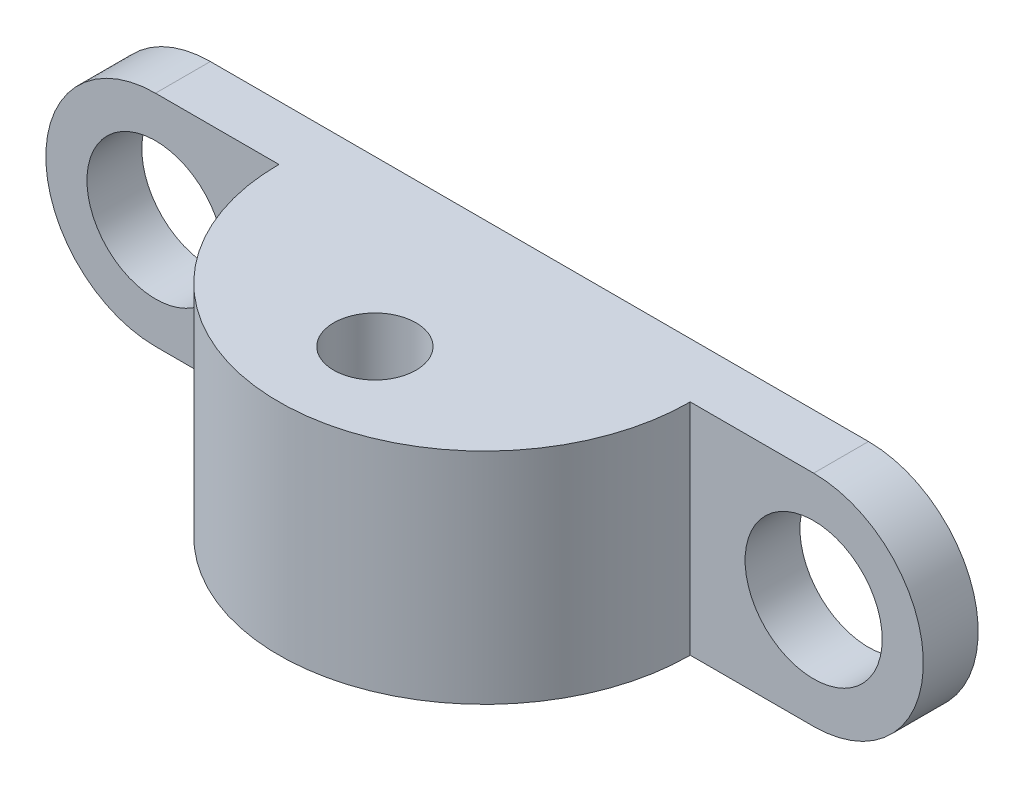
ISO-10303-21;
HEADER;
FILE_DESCRIPTION(('STEP AP214'),'2;1');
FILE_NAME('part.step','',(''),(''),'','','');
FILE_SCHEMA(('AUTOMOTIVE_DESIGN { 1 0 10303 214 1 1 1 1 }'));
ENDSEC;
DATA;
#1=APPLICATION_CONTEXT('core data for automotive mechanical design processes');
#2=APPLICATION_PROTOCOL_DEFINITION('international standard','automotive_design',2000,#1);
#3=PRODUCT_CONTEXT('',#1,'mechanical');
#4=PRODUCT('Part','Part','',(#3));
#5=PRODUCT_RELATED_PRODUCT_CATEGORY('part','',(#4));
#6=PRODUCT_DEFINITION_FORMATION('','',#4);
#7=PRODUCT_DEFINITION_CONTEXT('part definition',#1,'design');
#8=PRODUCT_DEFINITION('design','',#6,#7);
#9=PRODUCT_DEFINITION_SHAPE('','',#8);
#10=(LENGTH_UNIT() NAMED_UNIT(*) SI_UNIT(.MILLI.,.METRE.));
#11=(NAMED_UNIT(*) PLANE_ANGLE_UNIT() SI_UNIT($,.RADIAN.));
#12=(NAMED_UNIT(*) SI_UNIT($,.STERADIAN.) SOLID_ANGLE_UNIT());
#13=UNCERTAINTY_MEASURE_WITH_UNIT(LENGTH_MEASURE(1.E-05),#10,'distance_accuracy_value','');
#14=(GEOMETRIC_REPRESENTATION_CONTEXT(3) GLOBAL_UNCERTAINTY_ASSIGNED_CONTEXT((#13)) GLOBAL_UNIT_ASSIGNED_CONTEXT((#10,
#11,#12)) REPRESENTATION_CONTEXT('',''));
#15=CARTESIAN_POINT('',(0.,0.,0.));
#16=DIRECTION('',(0.,0.,1.));
#17=DIRECTION('',(1.,0.,0.));
#18=AXIS2_PLACEMENT_3D('',#15,#16,#17);
#19=CARTESIAN_POINT('',(0.,0.,2.));
#20=DIRECTION('',(0.,0.,1.));
#21=DIRECTION('',(1.,0.,0.));
#22=AXIS2_PLACEMENT_3D('',#19,#20,#21);
#23=PLANE('',#22);
#24=CARTESIAN_POINT('',(0.,0.,2.));
#25=DIRECTION('',(0.,0.,1.));
#26=DIRECTION('',(1.,0.,0.));
#27=AXIS2_PLACEMENT_3D('',#24,#25,#26);
#28=CIRCLE('',#27,2.5);
#29=CARTESIAN_POINT('',(2.5,0.,2.));
#30=VERTEX_POINT('',#29);
#31=EDGE_CURVE('E193',#30,#30,#28,.T.);
#32=ORIENTED_EDGE('',*,*,#31,.F.);
#33=EDGE_LOOP('',(#32));
#34=FACE_BOUND('',#33,.T.);
#35=CARTESIAN_POINT('',(0.,0.,2.));
#36=DIRECTION('',(0.,0.,1.));
#37=DIRECTION('',(1.,0.,0.));
#38=AXIS2_PLACEMENT_3D('',#35,#36,#37);
#39=CIRCLE('',#38,4.);
#40=CARTESIAN_POINT('',(0.,4.,2.));
#41=VERTEX_POINT('',#40);
#42=CARTESIAN_POINT('',(0.,-4.,2.));
#43=VERTEX_POINT('',#42);
#44=EDGE_CURVE('E160',#41,#43,#39,.T.);
#45=ORIENTED_EDGE('',*,*,#44,.T.);
#46=DIRECTION('',(1.,0.,0.));
#47=VECTOR('',#46,1.);
#48=CARTESIAN_POINT('',(0.,-4.,2.));
#49=LINE('',#48,#47);
#50=CARTESIAN_POINT('',(4.5,-4.,2.));
#51=VERTEX_POINT('',#50);
#52=EDGE_CURVE('E136',#43,#51,#49,.T.);
#53=ORIENTED_EDGE('',*,*,#52,.T.);
#54=DIRECTION('',(0.,-1.,0.));
#55=VECTOR('',#54,1.);
#56=CARTESIAN_POINT('',(4.5,29.8118189982806,2.));
#57=LINE('',#56,#55);
#58=CARTESIAN_POINT('',(4.5,4.,2.));
#59=VERTEX_POINT('',#58);
#60=EDGE_CURVE('E125',#59,#51,#57,.T.);
#61=ORIENTED_EDGE('',*,*,#60,.F.);
#62=DIRECTION('',(1.,0.,0.));
#63=VECTOR('',#62,1.);
#64=CARTESIAN_POINT('',(0.,4.,2.));
#65=LINE('',#64,#63);
#66=EDGE_CURVE('E135',#41,#59,#65,.T.);
#67=ORIENTED_EDGE('',*,*,#66,.F.);
#68=EDGE_LOOP('',(#45,#53,#61,#67));
#69=FACE_BOUND('',#68,.T.);
#70=ADVANCED_FACE('F68',(#34,#69),#23,.T.);
#71=CARTESIAN_POINT('',(0.,-4.,2.));
#72=DIRECTION('',(0.,1.,0.));
#73=DIRECTION('',(0.,0.,1.));
#74=AXIS2_PLACEMENT_3D('',#71,#72,#73);
#75=PLANE('',#74);
#76=DIRECTION('',(1.,0.,0.));
#77=VECTOR('',#76,1.);
#78=CARTESIAN_POINT('',(0.,-4.,0.));
#79=LINE('',#78,#77);
#80=CARTESIAN_POINT('',(0.,-4.,0.));
#81=VERTEX_POINT('',#80);
#82=CARTESIAN_POINT('',(24.,-4.,0.));
#83=VERTEX_POINT('',#82);
#84=EDGE_CURVE('E151',#81,#83,#79,.T.);
#85=ORIENTED_EDGE('',*,*,#84,.T.);
#86=DIRECTION('',(0.,0.,-1.));
#87=VECTOR('',#86,1.);
#88=CARTESIAN_POINT('',(24.,-4.,2.));
#89=LINE('',#88,#87);
#90=CARTESIAN_POINT('',(24.,-4.,2.));
#91=VERTEX_POINT('',#90);
#92=EDGE_CURVE('E76',#91,#83,#89,.T.);
#93=ORIENTED_EDGE('',*,*,#92,.F.);
#94=CARTESIAN_POINT('',(19.5,-4.,2.));
#95=VERTEX_POINT('',#94);
#96=EDGE_CURVE('E178',#95,#91,#49,.T.);
#97=ORIENTED_EDGE('',*,*,#96,.F.);
#98=CARTESIAN_POINT('',(12.,-4.,2.));
#99=DIRECTION('',(0.,-1.,0.));
#100=DIRECTION('',(0.,0.,-1.));
#101=AXIS2_PLACEMENT_3D('',#98,#99,#100);
#102=CIRCLE('',#101,7.5);
#103=EDGE_CURVE('E137',#95,#51,#102,.T.);
#104=ORIENTED_EDGE('',*,*,#103,.T.);
#105=ORIENTED_EDGE('',*,*,#52,.F.);
#106=DIRECTION('',(0.,0.,-1.));
#107=VECTOR('',#106,1.);
#108=CARTESIAN_POINT('',(0.,-4.,2.));
#109=LINE('',#108,#107);
#110=EDGE_CURVE('E12',#43,#81,#109,.T.);
#111=ORIENTED_EDGE('',*,*,#110,.T.);
#112=EDGE_LOOP('',(#85,#93,#97,#104,#105,#111));
#113=FACE_BOUND('',#112,.T.);
#114=CARTESIAN_POINT('',(12.,-4.,6.));
#115=DIRECTION('',(0.,-1.,0.));
#116=DIRECTION('',(0.,0.,-1.));
#117=AXIS2_PLACEMENT_3D('',#114,#115,#116);
#118=CIRCLE('',#117,1.5);
#119=CARTESIAN_POINT('',(12.,-4.,4.5));
#120=VERTEX_POINT('',#119);
#121=EDGE_CURVE('E128',#120,#120,#118,.T.);
#122=ORIENTED_EDGE('',*,*,#121,.F.);
#123=EDGE_LOOP('',(#122));
#124=FACE_BOUND('',#123,.T.);
#125=ADVANCED_FACE('F172',(#113,#124),#75,.F.);
#126=CARTESIAN_POINT('',(0.,4.,2.));
#127=DIRECTION('',(0.,1.,0.));
#128=DIRECTION('',(0.,0.,1.));
#129=AXIS2_PLACEMENT_3D('',#126,#127,#128);
#130=PLANE('',#129);
#131=DIRECTION('',(1.,0.,0.));
#132=VECTOR('',#131,1.);
#133=CARTESIAN_POINT('',(0.,4.,0.));
#134=LINE('',#133,#132);
#135=CARTESIAN_POINT('',(0.,4.,0.));
#136=VERTEX_POINT('',#135);
#137=CARTESIAN_POINT('',(24.,4.,0.));
#138=VERTEX_POINT('',#137);
#139=EDGE_CURVE('E158',#136,#138,#134,.T.);
#140=ORIENTED_EDGE('',*,*,#139,.F.);
#141=DIRECTION('',(0.,0.,-1.));
#142=VECTOR('',#141,1.);
#143=CARTESIAN_POINT('',(0.,4.,2.));
#144=LINE('',#143,#142);
#145=EDGE_CURVE('E92',#41,#136,#144,.T.);
#146=ORIENTED_EDGE('',*,*,#145,.F.);
#147=ORIENTED_EDGE('',*,*,#66,.T.);
#148=CARTESIAN_POINT('',(12.,4.,2.));
#149=DIRECTION('',(0.,1.,0.));
#150=DIRECTION('',(0.,0.,1.));
#151=AXIS2_PLACEMENT_3D('',#148,#149,#150);
#152=CIRCLE('',#151,7.5);
#153=CARTESIAN_POINT('',(19.5,4.,2.));
#154=VERTEX_POINT('',#153);
#155=EDGE_CURVE('E122',#154,#59,#152,.F.);
#156=ORIENTED_EDGE('',*,*,#155,.F.);
#157=CARTESIAN_POINT('',(24.,4.,2.));
#158=VERTEX_POINT('',#157);
#159=EDGE_CURVE('E141',#154,#158,#65,.T.);
#160=ORIENTED_EDGE('',*,*,#159,.T.);
#161=DIRECTION('',(0.,0.,-1.));
#162=VECTOR('',#161,1.);
#163=CARTESIAN_POINT('',(24.,4.,2.));
#164=LINE('',#163,#162);
#165=EDGE_CURVE('E143',#158,#138,#164,.T.);
#166=ORIENTED_EDGE('',*,*,#165,.T.);
#167=EDGE_LOOP('',(#140,#146,#147,#156,#160,#166));
#168=FACE_BOUND('',#167,.T.);
#169=CARTESIAN_POINT('',(12.,4.,6.));
#170=DIRECTION('',(0.,1.,0.));
#171=DIRECTION('',(0.,0.,1.));
#172=AXIS2_PLACEMENT_3D('',#169,#170,#171);
#173=CIRCLE('',#172,1.5);
#174=CARTESIAN_POINT('',(12.,4.,7.5));
#175=VERTEX_POINT('',#174);
#176=EDGE_CURVE('E152',#175,#175,#173,.F.);
#177=ORIENTED_EDGE('',*,*,#176,.T.);
#178=EDGE_LOOP('',(#177));
#179=FACE_BOUND('',#178,.T.);
#180=ADVANCED_FACE('F139',(#168,#179),#130,.T.);
#181=CARTESIAN_POINT('',(24.,0.,2.));
#182=DIRECTION('',(0.,0.,-1.));
#183=DIRECTION('',(-1.,0.,0.));
#184=AXIS2_PLACEMENT_3D('',#181,#182,#183);
#185=CYLINDRICAL_SURFACE('',#184,4.00000000000001);
#186=CARTESIAN_POINT('',(24.,0.,0.));
#187=DIRECTION('',(0.,0.,1.));
#188=DIRECTION('',(1.,0.,0.));
#189=AXIS2_PLACEMENT_3D('',#186,#187,#188);
#190=CIRCLE('',#189,4.00000000000001);
#191=EDGE_CURVE('E155',#83,#138,#190,.T.);
#192=ORIENTED_EDGE('',*,*,#191,.T.);
#193=ORIENTED_EDGE('',*,*,#165,.F.);
#194=CARTESIAN_POINT('',(24.,0.,2.));
#195=DIRECTION('',(0.,0.,1.));
#196=DIRECTION('',(1.,0.,0.));
#197=AXIS2_PLACEMENT_3D('',#194,#195,#196);
#198=CIRCLE('',#197,4.00000000000001);
#199=EDGE_CURVE('E145',#91,#158,#198,.T.);
#200=ORIENTED_EDGE('',*,*,#199,.F.);
#201=ORIENTED_EDGE('',*,*,#92,.T.);
#202=EDGE_LOOP('',(#192,#193,#200,#201));
#203=FACE_BOUND('',#202,.T.);
#204=ADVANCED_FACE('F165',(#203),#185,.T.);
#205=CARTESIAN_POINT('',(0.,0.,0.));
#206=DIRECTION('',(0.,0.,1.));
#207=DIRECTION('',(1.,0.,0.));
#208=AXIS2_PLACEMENT_3D('',#205,#206,#207);
#209=PLANE('',#208);
#210=CARTESIAN_POINT('',(0.,0.,0.));
#211=DIRECTION('',(0.,0.,1.));
#212=DIRECTION('',(1.,0.,0.));
#213=AXIS2_PLACEMENT_3D('',#210,#211,#212);
#214=CIRCLE('',#213,2.5);
#215=CARTESIAN_POINT('',(2.5,0.,0.));
#216=VERTEX_POINT('',#215);
#217=EDGE_CURVE('E129',#216,#216,#214,.T.);
#218=ORIENTED_EDGE('',*,*,#217,.T.);
#219=EDGE_LOOP('',(#218));
#220=FACE_BOUND('',#219,.T.);
#221=CARTESIAN_POINT('',(24.,0.,0.));
#222=DIRECTION('',(0.,0.,1.));
#223=DIRECTION('',(1.,0.,0.));
#224=AXIS2_PLACEMENT_3D('',#221,#222,#223);
#225=CIRCLE('',#224,2.5);
#226=CARTESIAN_POINT('',(26.5,0.,0.));
#227=VERTEX_POINT('',#226);
#228=EDGE_CURVE('E187',#227,#227,#225,.T.);
#229=ORIENTED_EDGE('',*,*,#228,.T.);
#230=EDGE_LOOP('',(#229));
#231=FACE_BOUND('',#230,.T.);
#232=ORIENTED_EDGE('',*,*,#191,.F.);
#233=ORIENTED_EDGE('',*,*,#84,.F.);
#234=CARTESIAN_POINT('',(0.,0.,0.));
#235=DIRECTION('',(0.,0.,1.));
#236=DIRECTION('',(1.,0.,0.));
#237=AXIS2_PLACEMENT_3D('',#234,#235,#236);
#238=CIRCLE('',#237,4.);
#239=EDGE_CURVE('E149',#136,#81,#238,.T.);
#240=ORIENTED_EDGE('',*,*,#239,.F.);
#241=ORIENTED_EDGE('',*,*,#139,.T.);
#242=EDGE_LOOP('',(#232,#233,#240,#241));
#243=FACE_BOUND('',#242,.T.);
#244=ADVANCED_FACE('F175',(#220,#231,#243),#209,.F.);
#245=CARTESIAN_POINT('',(24.,0.,2.));
#246=DIRECTION('',(0.,0.,1.));
#247=DIRECTION('',(1.,0.,0.));
#248=AXIS2_PLACEMENT_3D('',#245,#246,#247);
#249=CIRCLE('',#248,2.5);
#250=CARTESIAN_POINT('',(26.5,0.,2.));
#251=VERTEX_POINT('',#250);
#252=EDGE_CURVE('E190',#251,#251,#249,.T.);
#253=ORIENTED_EDGE('',*,*,#252,.F.);
#254=EDGE_LOOP('',(#253));
#255=FACE_BOUND('',#254,.T.);
#256=ORIENTED_EDGE('',*,*,#199,.T.);
#257=ORIENTED_EDGE('',*,*,#159,.F.);
#258=DIRECTION('',(0.,-1.,0.));
#259=VECTOR('',#258,1.);
#260=CARTESIAN_POINT('',(19.5,29.8118189982806,2.));
#261=LINE('',#260,#259);
#262=EDGE_CURVE('E83',#154,#95,#261,.T.);
#263=ORIENTED_EDGE('',*,*,#262,.T.);
#264=ORIENTED_EDGE('',*,*,#96,.T.);
#265=EDGE_LOOP('',(#256,#257,#263,#264));
#266=FACE_BOUND('',#265,.T.);
#267=ADVANCED_FACE('F177',(#255,#266),#23,.T.);
#268=CARTESIAN_POINT('',(0.,0.,2.));
#269=DIRECTION('',(0.,0.,-1.));
#270=DIRECTION('',(-1.,0.,0.));
#271=AXIS2_PLACEMENT_3D('',#268,#269,#270);
#272=CYLINDRICAL_SURFACE('',#271,4.);
#273=ORIENTED_EDGE('',*,*,#239,.T.);
#274=ORIENTED_EDGE('',*,*,#110,.F.);
#275=ORIENTED_EDGE('',*,*,#44,.F.);
#276=ORIENTED_EDGE('',*,*,#145,.T.);
#277=EDGE_LOOP('',(#273,#274,#275,#276));
#278=FACE_BOUND('',#277,.T.);
#279=ADVANCED_FACE('F70',(#278),#272,.T.);
#280=CARTESIAN_POINT('',(12.,29.8118189982806,6.));
#281=DIRECTION('',(0.,-1.,0.));
#282=DIRECTION('',(0.,0.,-1.));
#283=AXIS2_PLACEMENT_3D('',#280,#281,#282);
#284=CYLINDRICAL_SURFACE('',#283,1.5);
#285=ORIENTED_EDGE('',*,*,#121,.T.);
#286=EDGE_LOOP('',(#285));
#287=FACE_BOUND('',#286,.T.);
#288=ORIENTED_EDGE('',*,*,#176,.F.);
#289=EDGE_LOOP('',(#288));
#290=FACE_BOUND('',#289,.T.);
#291=ADVANCED_FACE('F226',(#287,#290),#284,.F.);
#292=CARTESIAN_POINT('',(12.,29.8118189982806,2.));
#293=DIRECTION('',(0.,-1.,0.));
#294=DIRECTION('',(0.,0.,-1.));
#295=AXIS2_PLACEMENT_3D('',#292,#293,#294);
#296=CYLINDRICAL_SURFACE('',#295,7.5);
#297=ORIENTED_EDGE('',*,*,#262,.F.);
#298=ORIENTED_EDGE('',*,*,#155,.T.);
#299=ORIENTED_EDGE('',*,*,#60,.T.);
#300=ORIENTED_EDGE('',*,*,#103,.F.);
#301=EDGE_LOOP('',(#297,#298,#299,#300));
#302=FACE_BOUND('',#301,.T.);
#303=ADVANCED_FACE('F124',(#302),#296,.T.);
#304=CARTESIAN_POINT('',(24.,0.,0.));
#305=DIRECTION('',(0.,0.,1.));
#306=DIRECTION('',(1.,0.,0.));
#307=AXIS2_PLACEMENT_3D('',#304,#305,#306);
#308=CYLINDRICAL_SURFACE('',#307,2.5);
#309=ORIENTED_EDGE('',*,*,#228,.F.);
#310=EDGE_LOOP('',(#309));
#311=FACE_BOUND('',#310,.T.);
#312=ORIENTED_EDGE('',*,*,#252,.T.);
#313=EDGE_LOOP('',(#312));
#314=FACE_BOUND('',#313,.T.);
#315=ADVANCED_FACE('F204',(#311,#314),#308,.F.);
#316=CARTESIAN_POINT('',(0.,0.,0.));
#317=DIRECTION('',(0.,0.,1.));
#318=DIRECTION('',(1.,0.,0.));
#319=AXIS2_PLACEMENT_3D('',#316,#317,#318);
#320=CYLINDRICAL_SURFACE('',#319,2.5);
#321=ORIENTED_EDGE('',*,*,#217,.F.);
#322=EDGE_LOOP('',(#321));
#323=FACE_BOUND('',#322,.T.);
#324=ORIENTED_EDGE('',*,*,#31,.T.);
#325=EDGE_LOOP('',(#324));
#326=FACE_BOUND('',#325,.T.);
#327=ADVANCED_FACE('F201',(#323,#326),#320,.F.);
#328=CLOSED_SHELL('',(#70,#125,#180,#204,#244,#267,#279,#291,#303,#315,#327));
#329=MANIFOLD_SOLID_BREP('B2',#328);
#330=ADVANCED_BREP_SHAPE_REPRESENTATION('',(#18,#329),#14);
#331=SHAPE_DEFINITION_REPRESENTATION(#9,#330);
ENDSEC;
END-ISO-10303-21;
